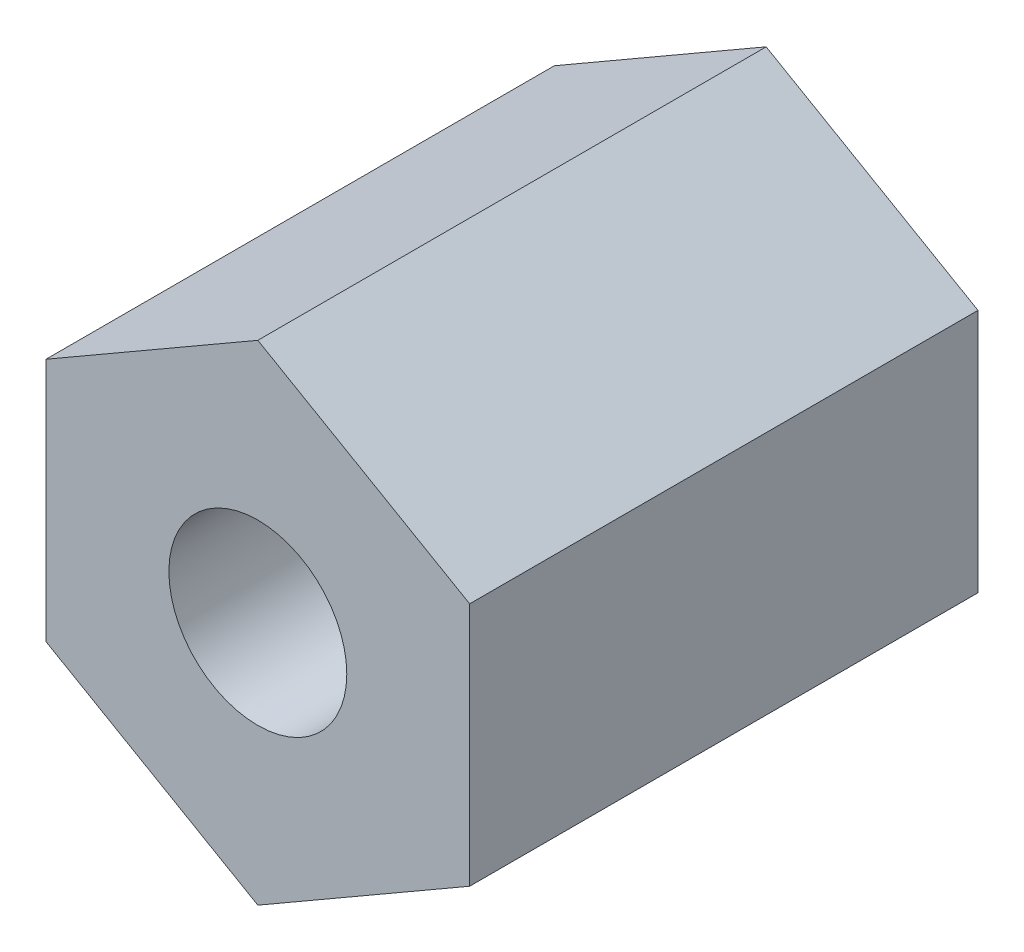
ISO-10303-21;
HEADER;
FILE_DESCRIPTION(('STEP AP214'),'2;1');
FILE_NAME('part.step','',(''),(''),'','','');
FILE_SCHEMA(('AUTOMOTIVE_DESIGN { 1 0 10303 214 1 1 1 1 }'));
ENDSEC;
DATA;
#1=APPLICATION_CONTEXT('core data for automotive mechanical design processes');
#2=APPLICATION_PROTOCOL_DEFINITION('international standard','automotive_design',2000,#1);
#3=PRODUCT_CONTEXT('',#1,'mechanical');
#4=PRODUCT('Part','Part','',(#3));
#5=PRODUCT_RELATED_PRODUCT_CATEGORY('part','',(#4));
#6=PRODUCT_DEFINITION_FORMATION('','',#4);
#7=PRODUCT_DEFINITION_CONTEXT('part definition',#1,'design');
#8=PRODUCT_DEFINITION('design','',#6,#7);
#9=PRODUCT_DEFINITION_SHAPE('','',#8);
#10=(LENGTH_UNIT() NAMED_UNIT(*) SI_UNIT(.MILLI.,.METRE.));
#11=(NAMED_UNIT(*) PLANE_ANGLE_UNIT() SI_UNIT($,.RADIAN.));
#12=(NAMED_UNIT(*) SI_UNIT($,.STERADIAN.) SOLID_ANGLE_UNIT());
#13=UNCERTAINTY_MEASURE_WITH_UNIT(LENGTH_MEASURE(1.E-05),#10,'distance_accuracy_value','');
#14=(GEOMETRIC_REPRESENTATION_CONTEXT(3) GLOBAL_UNCERTAINTY_ASSIGNED_CONTEXT((#13)) GLOBAL_UNIT_ASSIGNED_CONTEXT((#10,
#11,#12)) REPRESENTATION_CONTEXT('',''));
#15=CARTESIAN_POINT('',(0.,0.,0.));
#16=DIRECTION('',(0.,0.,1.));
#17=DIRECTION('',(1.,0.,0.));
#18=AXIS2_PLACEMENT_3D('',#15,#16,#17);
#19=CARTESIAN_POINT('',(-105.999784659274,-57.4435,18.7));
#20=DIRECTION('',(-1.,0.,0.));
#21=DIRECTION('',(0.,0.,1.));
#22=AXIS2_PLACEMENT_3D('',#19,#20,#21);
#23=PLANE('',#22);
#24=DIRECTION('',(0.,1.,0.));
#25=VECTOR('',#24,1.);
#26=CARTESIAN_POINT('',(-105.999784659274,-57.4435,12.7));
#27=LINE('',#26,#25);
#28=CARTESIAN_POINT('',(-105.999784659274,-57.4435,12.7));
#29=VERTEX_POINT('',#28);
#30=CARTESIAN_POINT('',(-105.999784659274,-54.5565,12.7));
#31=VERTEX_POINT('',#30);
#32=EDGE_CURVE('E133',#29,#31,#27,.T.);
#33=ORIENTED_EDGE('',*,*,#32,.T.);
#34=DIRECTION('',(0.,0.,-1.));
#35=VECTOR('',#34,1.);
#36=CARTESIAN_POINT('',(-105.999784659274,-54.5565,18.7));
#37=LINE('',#36,#35);
#38=CARTESIAN_POINT('',(-105.999784659274,-54.5565,18.7));
#39=VERTEX_POINT('',#38);
#40=EDGE_CURVE('E11',#39,#31,#37,.T.);
#41=ORIENTED_EDGE('',*,*,#40,.F.);
#42=DIRECTION('',(0.,1.,0.));
#43=VECTOR('',#42,1.);
#44=CARTESIAN_POINT('',(-105.999784659274,-57.4435,18.7));
#45=LINE('',#44,#43);
#46=CARTESIAN_POINT('',(-105.999784659274,-57.4435,18.7));
#47=VERTEX_POINT('',#46);
#48=EDGE_CURVE('E151',#47,#39,#45,.T.);
#49=ORIENTED_EDGE('',*,*,#48,.F.);
#50=DIRECTION('',(0.,0.,-1.));
#51=VECTOR('',#50,1.);
#52=CARTESIAN_POINT('',(-105.999784659274,-57.4435,18.7));
#53=LINE('',#52,#51);
#54=EDGE_CURVE('E128',#47,#29,#53,.T.);
#55=ORIENTED_EDGE('',*,*,#54,.T.);
#56=EDGE_LOOP('',(#33,#41,#49,#55));
#57=FACE_BOUND('',#56,.T.);
#58=ADVANCED_FACE('F44',(#57),#23,.F.);
#59=CARTESIAN_POINT('',(-105.999784659274,-54.5565,18.7));
#60=DIRECTION('',(-0.500000000000001,-0.866025403784438,0.));
#61=DIRECTION('',(0.866025403784438,-0.500000000000001,0.));
#62=AXIS2_PLACEMENT_3D('',#59,#60,#61);
#63=PLANE('',#62);
#64=DIRECTION('',(-0.866025403784438,0.500000000000001,0.));
#65=VECTOR('',#64,1.);
#66=CARTESIAN_POINT('',(-105.999784659274,-54.5565,12.7));
#67=LINE('',#66,#65);
#68=CARTESIAN_POINT('',(-108.5,-53.113,12.7));
#69=VERTEX_POINT('',#68);
#70=EDGE_CURVE('E140',#31,#69,#67,.T.);
#71=ORIENTED_EDGE('',*,*,#70,.T.);
#72=DIRECTION('',(0.,0.,-1.));
#73=VECTOR('',#72,1.);
#74=CARTESIAN_POINT('',(-108.5,-53.113,18.7));
#75=LINE('',#74,#73);
#76=CARTESIAN_POINT('',(-108.5,-53.113,18.7));
#77=VERTEX_POINT('',#76);
#78=EDGE_CURVE('E53',#77,#69,#75,.T.);
#79=ORIENTED_EDGE('',*,*,#78,.F.);
#80=DIRECTION('',(-0.866025403784438,0.500000000000001,0.));
#81=VECTOR('',#80,1.);
#82=CARTESIAN_POINT('',(-105.999784659274,-54.5565,18.7));
#83=LINE('',#82,#81);
#84=EDGE_CURVE('E97',#39,#77,#83,.T.);
#85=ORIENTED_EDGE('',*,*,#84,.F.);
#86=ORIENTED_EDGE('',*,*,#40,.T.);
#87=EDGE_LOOP('',(#71,#79,#85,#86));
#88=FACE_BOUND('',#87,.T.);
#89=ADVANCED_FACE('F178',(#88),#63,.F.);
#90=CARTESIAN_POINT('',(-108.5,-53.113,18.7));
#91=DIRECTION('',(0.499999999999999,-0.866025403784439,0.));
#92=DIRECTION('',(0.866025403784439,0.499999999999999,0.));
#93=AXIS2_PLACEMENT_3D('',#90,#91,#92);
#94=PLANE('',#93);
#95=DIRECTION('',(-0.866025403784439,-0.499999999999999,0.));
#96=VECTOR('',#95,1.);
#97=CARTESIAN_POINT('',(-108.5,-53.113,12.7));
#98=LINE('',#97,#96);
#99=CARTESIAN_POINT('',(-111.000215340726,-54.5565,12.7));
#100=VERTEX_POINT('',#99);
#101=EDGE_CURVE('E142',#69,#100,#98,.T.);
#102=ORIENTED_EDGE('',*,*,#101,.T.);
#103=DIRECTION('',(0.,0.,-1.));
#104=VECTOR('',#103,1.);
#105=CARTESIAN_POINT('',(-111.000215340726,-54.5565,18.7));
#106=LINE('',#105,#104);
#107=CARTESIAN_POINT('',(-111.000215340726,-54.5565,18.7));
#108=VERTEX_POINT('',#107);
#109=EDGE_CURVE('E125',#108,#100,#106,.T.);
#110=ORIENTED_EDGE('',*,*,#109,.F.);
#111=DIRECTION('',(-0.866025403784439,-0.499999999999999,0.));
#112=VECTOR('',#111,1.);
#113=CARTESIAN_POINT('',(-108.5,-53.113,18.7));
#114=LINE('',#113,#112);
#115=EDGE_CURVE('E115',#77,#108,#114,.T.);
#116=ORIENTED_EDGE('',*,*,#115,.F.);
#117=ORIENTED_EDGE('',*,*,#78,.T.);
#118=EDGE_LOOP('',(#102,#110,#116,#117));
#119=FACE_BOUND('',#118,.T.);
#120=ADVANCED_FACE('F161',(#119),#94,.F.);
#121=CARTESIAN_POINT('',(-111.000215340726,-54.5565,18.7));
#122=DIRECTION('',(1.,0.,0.));
#123=DIRECTION('',(0.,0.,-1.));
#124=AXIS2_PLACEMENT_3D('',#121,#122,#123);
#125=PLANE('',#124);
#126=DIRECTION('',(0.,-1.,0.));
#127=VECTOR('',#126,1.);
#128=CARTESIAN_POINT('',(-111.000215340726,-54.5565,12.7));
#129=LINE('',#128,#127);
#130=CARTESIAN_POINT('',(-111.000215340726,-57.4435,12.7));
#131=VERTEX_POINT('',#130);
#132=EDGE_CURVE('E122',#100,#131,#129,.T.);
#133=ORIENTED_EDGE('',*,*,#132,.T.);
#134=DIRECTION('',(0.,0.,-1.));
#135=VECTOR('',#134,1.);
#136=CARTESIAN_POINT('',(-111.000215340726,-57.4435,18.7));
#137=LINE('',#136,#135);
#138=CARTESIAN_POINT('',(-111.000215340726,-57.4435,18.7));
#139=VERTEX_POINT('',#138);
#140=EDGE_CURVE('E120',#139,#131,#137,.T.);
#141=ORIENTED_EDGE('',*,*,#140,.F.);
#142=DIRECTION('',(0.,-1.,0.));
#143=VECTOR('',#142,1.);
#144=CARTESIAN_POINT('',(-111.000215340726,-54.5565,18.7));
#145=LINE('',#144,#143);
#146=EDGE_CURVE('E106',#108,#139,#145,.T.);
#147=ORIENTED_EDGE('',*,*,#146,.F.);
#148=ORIENTED_EDGE('',*,*,#109,.T.);
#149=EDGE_LOOP('',(#133,#141,#147,#148));
#150=FACE_BOUND('',#149,.T.);
#151=ADVANCED_FACE('F118',(#150),#125,.F.);
#152=CARTESIAN_POINT('',(-111.000215340726,-57.4435,18.7));
#153=DIRECTION('',(0.499999999999999,0.866025403784439,0.));
#154=DIRECTION('',(-0.866025403784439,0.499999999999999,0.));
#155=AXIS2_PLACEMENT_3D('',#152,#153,#154);
#156=PLANE('',#155);
#157=DIRECTION('',(0.866025403784439,-0.499999999999999,0.));
#158=VECTOR('',#157,1.);
#159=CARTESIAN_POINT('',(-111.000215340726,-57.4435,12.7));
#160=LINE('',#159,#158);
#161=CARTESIAN_POINT('',(-108.5,-58.887,12.7));
#162=VERTEX_POINT('',#161);
#163=EDGE_CURVE('E83',#131,#162,#160,.T.);
#164=ORIENTED_EDGE('',*,*,#163,.T.);
#165=DIRECTION('',(0.,0.,-1.));
#166=VECTOR('',#165,1.);
#167=CARTESIAN_POINT('',(-108.5,-58.887,18.7));
#168=LINE('',#167,#166);
#169=CARTESIAN_POINT('',(-108.5,-58.887,18.7));
#170=VERTEX_POINT('',#169);
#171=EDGE_CURVE('E121',#170,#162,#168,.T.);
#172=ORIENTED_EDGE('',*,*,#171,.F.);
#173=DIRECTION('',(0.866025403784439,-0.499999999999999,0.));
#174=VECTOR('',#173,1.);
#175=CARTESIAN_POINT('',(-111.000215340726,-57.4435,18.7));
#176=LINE('',#175,#174);
#177=EDGE_CURVE('E109',#139,#170,#176,.T.);
#178=ORIENTED_EDGE('',*,*,#177,.F.);
#179=ORIENTED_EDGE('',*,*,#140,.T.);
#180=EDGE_LOOP('',(#164,#172,#178,#179));
#181=FACE_BOUND('',#180,.T.);
#182=ADVANCED_FACE('F127',(#181),#156,.F.);
#183=CARTESIAN_POINT('',(-108.5,-58.887,18.7));
#184=DIRECTION('',(-0.500000000000001,0.866025403784438,0.));
#185=DIRECTION('',(-0.866025403784438,-0.500000000000001,0.));
#186=AXIS2_PLACEMENT_3D('',#183,#184,#185);
#187=PLANE('',#186);
#188=DIRECTION('',(0.866025403784438,0.500000000000001,0.));
#189=VECTOR('',#188,1.);
#190=CARTESIAN_POINT('',(-108.5,-58.887,12.7));
#191=LINE('',#190,#189);
#192=EDGE_CURVE('E93',#162,#29,#191,.T.);
#193=ORIENTED_EDGE('',*,*,#192,.T.);
#194=ORIENTED_EDGE('',*,*,#54,.F.);
#195=DIRECTION('',(0.866025403784438,0.500000000000001,0.));
#196=VECTOR('',#195,1.);
#197=CARTESIAN_POINT('',(-108.5,-58.887,18.7));
#198=LINE('',#197,#196);
#199=EDGE_CURVE('E61',#170,#47,#198,.T.);
#200=ORIENTED_EDGE('',*,*,#199,.F.);
#201=ORIENTED_EDGE('',*,*,#171,.T.);
#202=EDGE_LOOP('',(#193,#194,#200,#201));
#203=FACE_BOUND('',#202,.T.);
#204=ADVANCED_FACE('F169',(#203),#187,.F.);
#205=CARTESIAN_POINT('',(0.,0.,18.7));
#206=DIRECTION('',(0.,0.,1.));
#207=DIRECTION('',(1.,0.,0.));
#208=AXIS2_PLACEMENT_3D('',#205,#206,#207);
#209=PLANE('',#208);
#210=CARTESIAN_POINT('',(-108.5,-56.,18.7));
#211=DIRECTION('',(0.,0.,1.));
#212=DIRECTION('',(1.,0.,0.));
#213=AXIS2_PLACEMENT_3D('',#210,#211,#212);
#214=CIRCLE('',#213,1.05);
#215=CARTESIAN_POINT('',(-107.45,-56.,18.7));
#216=VERTEX_POINT('',#215);
#217=EDGE_CURVE('E136',#216,#216,#214,.T.);
#218=ORIENTED_EDGE('',*,*,#217,.F.);
#219=EDGE_LOOP('',(#218));
#220=FACE_BOUND('',#219,.T.);
#221=ORIENTED_EDGE('',*,*,#48,.T.);
#222=ORIENTED_EDGE('',*,*,#84,.T.);
#223=ORIENTED_EDGE('',*,*,#115,.T.);
#224=ORIENTED_EDGE('',*,*,#146,.T.);
#225=ORIENTED_EDGE('',*,*,#177,.T.);
#226=ORIENTED_EDGE('',*,*,#199,.T.);
#227=EDGE_LOOP('',(#221,#222,#223,#224,#225,#226));
#228=FACE_BOUND('',#227,.T.);
#229=ADVANCED_FACE('F107',(#220,#228),#209,.T.);
#230=CARTESIAN_POINT('',(0.,0.,12.7));
#231=DIRECTION('',(0.,0.,1.));
#232=DIRECTION('',(1.,0.,0.));
#233=AXIS2_PLACEMENT_3D('',#230,#231,#232);
#234=PLANE('',#233);
#235=CARTESIAN_POINT('',(-108.5,-56.,12.7));
#236=DIRECTION('',(0.,0.,1.));
#237=DIRECTION('',(1.,0.,0.));
#238=AXIS2_PLACEMENT_3D('',#235,#236,#237);
#239=CIRCLE('',#238,1.05);
#240=CARTESIAN_POINT('',(-107.45,-56.,12.7));
#241=VERTEX_POINT('',#240);
#242=EDGE_CURVE('E237',#241,#241,#239,.T.);
#243=ORIENTED_EDGE('',*,*,#242,.T.);
#244=EDGE_LOOP('',(#243));
#245=FACE_BOUND('',#244,.T.);
#246=ORIENTED_EDGE('',*,*,#32,.F.);
#247=ORIENTED_EDGE('',*,*,#192,.F.);
#248=ORIENTED_EDGE('',*,*,#163,.F.);
#249=ORIENTED_EDGE('',*,*,#132,.F.);
#250=ORIENTED_EDGE('',*,*,#101,.F.);
#251=ORIENTED_EDGE('',*,*,#70,.F.);
#252=EDGE_LOOP('',(#246,#247,#248,#249,#250,#251));
#253=FACE_BOUND('',#252,.T.);
#254=ADVANCED_FACE('F163',(#245,#253),#234,.F.);
#255=CARTESIAN_POINT('',(-108.5,-56.,18.7));
#256=DIRECTION('',(0.,0.,-1.));
#257=DIRECTION('',(-1.,0.,0.));
#258=AXIS2_PLACEMENT_3D('',#255,#256,#257);
#259=CYLINDRICAL_SURFACE('',#258,1.05);
#260=ORIENTED_EDGE('',*,*,#217,.T.);
#261=EDGE_LOOP('',(#260));
#262=FACE_BOUND('',#261,.T.);
#263=ORIENTED_EDGE('',*,*,#242,.F.);
#264=EDGE_LOOP('',(#263));
#265=FACE_BOUND('',#264,.T.);
#266=ADVANCED_FACE('F218',(#262,#265),#259,.F.);
#267=CLOSED_SHELL('',(#58,#89,#120,#151,#182,#204,#229,#254,#266));
#268=MANIFOLD_SOLID_BREP('B2',#267);
#269=ADVANCED_BREP_SHAPE_REPRESENTATION('',(#18,#268),#14);
#270=SHAPE_DEFINITION_REPRESENTATION(#9,#269);
ENDSEC;
END-ISO-10303-21;
